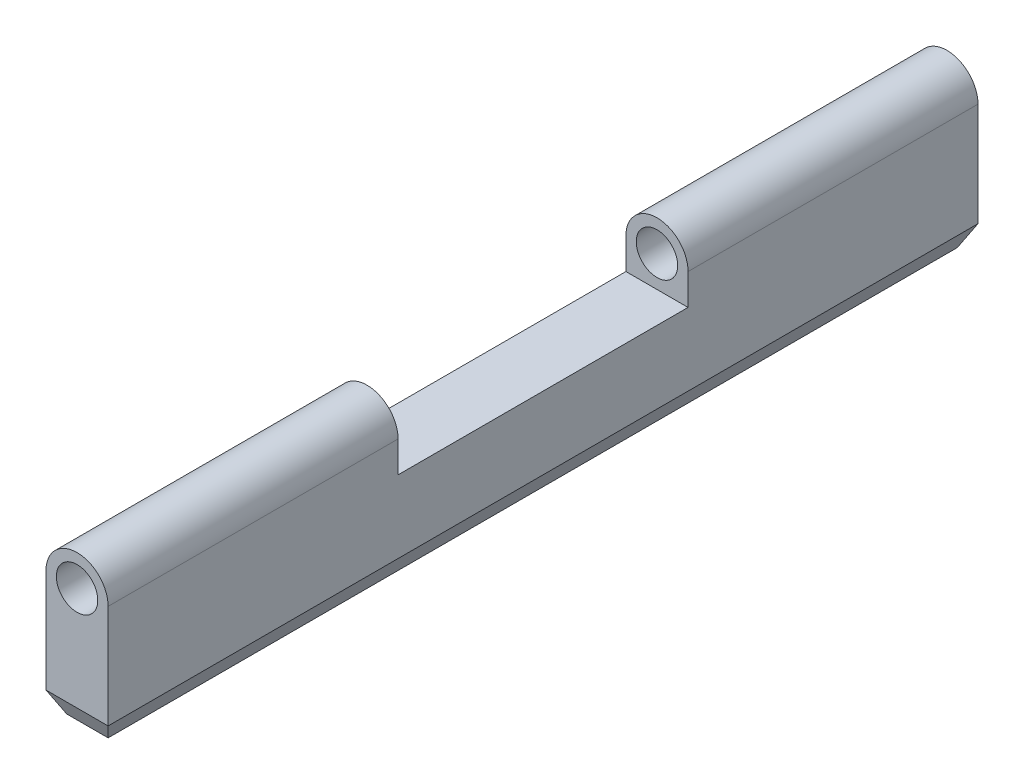
ISO-10303-21;
HEADER;
FILE_DESCRIPTION(('STEP AP214'),'2;1');
FILE_NAME('part.step','',(''),(''),'','','');
FILE_SCHEMA(('AUTOMOTIVE_DESIGN { 1 0 10303 214 1 1 1 1 }'));
ENDSEC;
DATA;
#1=APPLICATION_CONTEXT('core data for automotive mechanical design processes');
#2=APPLICATION_PROTOCOL_DEFINITION('international standard','automotive_design',2000,#1);
#3=PRODUCT_CONTEXT('',#1,'mechanical');
#4=PRODUCT('Part','Part','',(#3));
#5=PRODUCT_RELATED_PRODUCT_CATEGORY('part','',(#4));
#6=PRODUCT_DEFINITION_FORMATION('','',#4);
#7=PRODUCT_DEFINITION_CONTEXT('part definition',#1,'design');
#8=PRODUCT_DEFINITION('design','',#6,#7);
#9=PRODUCT_DEFINITION_SHAPE('','',#8);
#10=(LENGTH_UNIT() NAMED_UNIT(*) SI_UNIT(.MILLI.,.METRE.));
#11=(NAMED_UNIT(*) PLANE_ANGLE_UNIT() SI_UNIT($,.RADIAN.));
#12=(NAMED_UNIT(*) SI_UNIT($,.STERADIAN.) SOLID_ANGLE_UNIT());
#13=UNCERTAINTY_MEASURE_WITH_UNIT(LENGTH_MEASURE(1.E-05),#10,'distance_accuracy_value','');
#14=(GEOMETRIC_REPRESENTATION_CONTEXT(3) GLOBAL_UNCERTAINTY_ASSIGNED_CONTEXT((#13)) GLOBAL_UNIT_ASSIGNED_CONTEXT((#10,
#11,#12)) REPRESENTATION_CONTEXT('',''));
#15=CARTESIAN_POINT('',(0.,0.,0.));
#16=DIRECTION('',(0.,0.,1.));
#17=DIRECTION('',(1.,0.,0.));
#18=AXIS2_PLACEMENT_3D('',#15,#16,#17);
#19=CARTESIAN_POINT('',(0.,2.87122348122344,42.));
#20=DIRECTION('',(0.,0.,-1.));
#21=DIRECTION('',(-1.,0.,0.));
#22=AXIS2_PLACEMENT_3D('',#19,#20,#21);
#23=CYLINDRICAL_SURFACE('',#22,1.5);
#24=DIRECTION('',(0.,0.,-1.));
#25=VECTOR('',#24,1.);
#26=CARTESIAN_POINT('',(1.5,2.87122348122344,42.));
#27=LINE('',#26,#25);
#28=CARTESIAN_POINT('',(1.5,2.87122348122344,42.));
#29=VERTEX_POINT('',#28);
#30=CARTESIAN_POINT('',(1.5,2.87122348122344,28.));
#31=VERTEX_POINT('',#30);
#32=EDGE_CURVE('E175',#29,#31,#27,.T.);
#33=ORIENTED_EDGE('',*,*,#32,.T.);
#34=CARTESIAN_POINT('',(0.,2.87122348122344,28.));
#35=DIRECTION('',(0.,0.,1.));
#36=DIRECTION('',(0.,-1.,0.));
#37=AXIS2_PLACEMENT_3D('',#34,#35,#36);
#38=CIRCLE('',#37,1.5);
#39=CARTESIAN_POINT('',(-1.5,2.87122348122344,28.));
#40=VERTEX_POINT('',#39);
#41=EDGE_CURVE('E119',#31,#40,#38,.T.);
#42=ORIENTED_EDGE('',*,*,#41,.T.);
#43=DIRECTION('',(0.,0.,-1.));
#44=VECTOR('',#43,1.);
#45=CARTESIAN_POINT('',(-1.5,2.87122348122344,42.));
#46=LINE('',#45,#44);
#47=CARTESIAN_POINT('',(-1.5,2.87122348122344,42.));
#48=VERTEX_POINT('',#47);
#49=EDGE_CURVE('E178',#48,#40,#46,.T.);
#50=ORIENTED_EDGE('',*,*,#49,.F.);
#51=CARTESIAN_POINT('',(0.,2.87122348122344,42.));
#52=DIRECTION('',(0.,0.,1.));
#53=DIRECTION('',(-1.,0.,0.));
#54=AXIS2_PLACEMENT_3D('',#51,#52,#53);
#55=CIRCLE('',#54,1.5);
#56=EDGE_CURVE('E161',#29,#48,#55,.T.);
#57=ORIENTED_EDGE('',*,*,#56,.F.);
#58=EDGE_LOOP('',(#33,#42,#50,#57));
#59=FACE_BOUND('',#58,.T.);
#60=ADVANCED_FACE('F35',(#59),#23,.T.);
#61=CARTESIAN_POINT('',(0.,2.87122348122344,42.));
#62=DIRECTION('',(0.,0.,-1.));
#63=DIRECTION('',(-1.,0.,0.));
#64=AXIS2_PLACEMENT_3D('',#61,#62,#63);
#65=CYLINDRICAL_SURFACE('',#64,1.);
#66=CARTESIAN_POINT('',(0.,2.87122348122344,14.));
#67=DIRECTION('',(0.,0.,-1.));
#68=DIRECTION('',(-1.,0.,0.));
#69=AXIS2_PLACEMENT_3D('',#66,#67,#68);
#70=CIRCLE('',#69,1.);
#71=CARTESIAN_POINT('',(-1.,2.87122348122344,14.));
#72=VERTEX_POINT('',#71);
#73=EDGE_CURVE('E151',#72,#72,#70,.T.);
#74=CARTESIAN_POINT('',(0.,2.87122348122344,0.));
#75=DIRECTION('',(0.,0.,1.));
#76=DIRECTION('',(1.,0.,0.));
#77=AXIS2_PLACEMENT_3D('',#74,#75,#76);
#78=CIRCLE('',#77,1.);
#79=CARTESIAN_POINT('',(-1.,2.87122348122344,0.));
#80=VERTEX_POINT('',#79);
#81=EDGE_CURVE('E154',#80,#80,#78,.T.);
#82=CARTESIAN_POINT('',(-1.,2.87122348122344,14.));
#83=CARTESIAN_POINT('',(-1.,2.87122348122344,13.8541666666667));
#84=CARTESIAN_POINT('',(-1.,2.87122348122344,13.7083333333333));
#85=CARTESIAN_POINT('',(-1.,2.87122348122344,13.4166666666667));
#86=CARTESIAN_POINT('',(-1.,2.87122348122344,13.2708333333333));
#87=CARTESIAN_POINT('',(-1.,2.87122348122344,12.9791666666667));
#88=CARTESIAN_POINT('',(-1.,2.87122348122344,12.8333333333333));
#89=CARTESIAN_POINT('',(-1.,2.87122348122344,12.5416666666667));
#90=CARTESIAN_POINT('',(-1.,2.87122348122344,12.3958333333333));
#91=CARTESIAN_POINT('',(-1.,2.87122348122344,12.1041666666667));
#92=CARTESIAN_POINT('',(-1.,2.87122348122344,11.9583333333333));
#93=CARTESIAN_POINT('',(-1.,2.87122348122344,11.6666666666667));
#94=CARTESIAN_POINT('',(-1.,2.87122348122344,11.5208333333333));
#95=CARTESIAN_POINT('',(-1.,2.87122348122344,11.2291666666667));
#96=CARTESIAN_POINT('',(-1.,2.87122348122344,11.0833333333333));
#97=CARTESIAN_POINT('',(-1.,2.87122348122344,10.7916666666667));
#98=CARTESIAN_POINT('',(-1.,2.87122348122344,10.6458333333333));
#99=CARTESIAN_POINT('',(-1.,2.87122348122344,10.3541666666667));
#100=CARTESIAN_POINT('',(-1.,2.87122348122344,10.2083333333333));
#101=CARTESIAN_POINT('',(-1.,2.87122348122344,9.91666666666668));
#102=CARTESIAN_POINT('',(-1.,2.87122348122344,9.77083333333335));
#103=CARTESIAN_POINT('',(-1.,2.87122348122344,9.47916666666668));
#104=CARTESIAN_POINT('',(-1.,2.87122348122344,9.33333333333335));
#105=CARTESIAN_POINT('',(-1.,2.87122348122344,9.04166666666668));
#106=CARTESIAN_POINT('',(-1.,2.87122348122344,8.89583333333335));
#107=CARTESIAN_POINT('',(-1.,2.87122348122344,8.60416666666668));
#108=CARTESIAN_POINT('',(-1.,2.87122348122344,8.45833333333335));
#109=CARTESIAN_POINT('',(-1.,2.87122348122344,8.16666666666668));
#110=CARTESIAN_POINT('',(-1.,2.87122348122344,8.02083333333334));
#111=CARTESIAN_POINT('',(-1.,2.87122348122344,7.72916666666668));
#112=CARTESIAN_POINT('',(-1.,2.87122348122344,7.58333333333334));
#113=CARTESIAN_POINT('',(-1.,2.87122348122344,7.29166666666668));
#114=CARTESIAN_POINT('',(-1.,2.87122348122344,7.14583333333334));
#115=CARTESIAN_POINT('',(-1.,2.87122348122344,6.85416666666667));
#116=CARTESIAN_POINT('',(-1.,2.87122348122344,6.70833333333334));
#117=CARTESIAN_POINT('',(-1.,2.87122348122344,6.41666666666668));
#118=CARTESIAN_POINT('',(-1.,2.87122348122344,6.27083333333334));
#119=CARTESIAN_POINT('',(-1.,2.87122348122344,5.97916666666667));
#120=CARTESIAN_POINT('',(-1.,2.87122348122344,5.83333333333334));
#121=CARTESIAN_POINT('',(-1.,2.87122348122344,5.54166666666668));
#122=CARTESIAN_POINT('',(-1.,2.87122348122344,5.39583333333334));
#123=CARTESIAN_POINT('',(-1.,2.87122348122344,5.10416666666667));
#124=CARTESIAN_POINT('',(-1.,2.87122348122344,4.95833333333334));
#125=CARTESIAN_POINT('',(-1.,2.87122348122344,4.66666666666667));
#126=CARTESIAN_POINT('',(-1.,2.87122348122344,4.52083333333334));
#127=CARTESIAN_POINT('',(-1.,2.87122348122344,4.22916666666667));
#128=CARTESIAN_POINT('',(-1.,2.87122348122344,4.08333333333334));
#129=CARTESIAN_POINT('',(-1.,2.87122348122344,3.79166666666667));
#130=CARTESIAN_POINT('',(-1.,2.87122348122344,3.64583333333334));
#131=CARTESIAN_POINT('',(-1.,2.87122348122344,3.35416666666667));
#132=CARTESIAN_POINT('',(-1.,2.87122348122344,3.20833333333334));
#133=CARTESIAN_POINT('',(-1.,2.87122348122344,2.91666666666667));
#134=CARTESIAN_POINT('',(-1.,2.87122348122344,2.77083333333334));
#135=CARTESIAN_POINT('',(-1.,2.87122348122344,2.47916666666667));
#136=CARTESIAN_POINT('',(-1.,2.87122348122344,2.33333333333334));
#137=CARTESIAN_POINT('',(-1.,2.87122348122344,2.04166666666667));
#138=CARTESIAN_POINT('',(-1.,2.87122348122344,1.89583333333333));
#139=CARTESIAN_POINT('',(-1.,2.87122348122344,1.60416666666667));
#140=CARTESIAN_POINT('',(-1.,2.87122348122344,1.45833333333333));
#141=CARTESIAN_POINT('',(-1.,2.87122348122344,1.16666666666667));
#142=CARTESIAN_POINT('',(-1.,2.87122348122344,1.02083333333333));
#143=CARTESIAN_POINT('',(-1.,2.87122348122344,0.729166666666667));
#144=CARTESIAN_POINT('',(-1.,2.87122348122344,0.583333333333334));
#145=CARTESIAN_POINT('',(-1.,2.87122348122344,0.291666666666667));
#146=CARTESIAN_POINT('',(-1.,2.87122348122344,0.145833333333333));
#147=CARTESIAN_POINT('',(-1.,2.87122348122344,0.));
#148=B_SPLINE_CURVE_WITH_KNOTS('',3,(#82,#83,#84,#85,#86,#87,#88,#89,#90,#91,#92,#93,#94,#95,
#96,#97,#98,#99,#100,#101,#102,#103,#104,#105,#106,#107,#108,#109,#110,#111,#112,#113,#114,#115,
#116,#117,#118,#119,#120,#121,#122,#123,#124,#125,#126,#127,#128,#129,#130,#131,#132,#133,#134,
#135,#136,#137,#138,#139,#140,#141,#142,#143,#144,#145,#146,#147),.UNSPECIFIED.,.F.,.F.,(4,2,2,
2,2,2,2,2,2,2,2,2,2,2,2,2,2,2,2,2,2,2,2,2,2,2,2,2,2,2,2,2,4),(0.,0.4375,0.875000000000001,
1.3125,1.75,2.1875,2.625,3.0625,3.5,3.9375,4.375,4.8125,5.25,5.6875,6.12500000000001,6.5625,
7.00000000000001,7.4375,7.87500000000001,8.3125,8.75000000000001,9.18750000000001,
9.62500000000001,10.0625,10.5,10.9375,11.375,11.8125,12.25,12.6875,13.125,13.5625,14.),.UNSPECIFIED.);
#149=EDGE_CURVE('BSEAM247',#72,#80,#148,.T.);
#150=ORIENTED_EDGE('',*,*,#73,.F.);
#151=ORIENTED_EDGE('',*,*,#81,.F.);
#152=ORIENTED_EDGE('',*,*,#149,.T.);
#153=ORIENTED_EDGE('',*,*,#149,.F.);
#154=EDGE_LOOP('',(#150,#152,#151,#153));
#155=FACE_BOUND('',#154,.T.);
#156=ADVANCED_FACE('F247',(#155),#65,.F.);
#157=CARTESIAN_POINT('',(0.,2.87122348122344,42.));
#158=DIRECTION('',(0.,0.,-1.));
#159=DIRECTION('',(-1.,0.,0.));
#160=AXIS2_PLACEMENT_3D('',#157,#158,#159);
#161=PLANE('',#160);
#162=DIRECTION('',(0.,-1.,0.));
#163=VECTOR('',#162,1.);
#164=CARTESIAN_POINT('',(-1.5,2.87122348122344,42.));
#165=LINE('',#164,#163);
#166=CARTESIAN_POINT('',(-1.5,-2.12877651877655,42.));
#167=VERTEX_POINT('',#166);
#168=EDGE_CURVE('E164',#48,#167,#165,.T.);
#169=ORIENTED_EDGE('',*,*,#168,.T.);
#170=DIRECTION('',(1.,0.,0.));
#171=VECTOR('',#170,1.);
#172=CARTESIAN_POINT('',(0.,-2.12877651877655,42.));
#173=LINE('',#172,#171);
#174=CARTESIAN_POINT('',(1.5,-2.12877651877655,42.));
#175=VERTEX_POINT('',#174);
#176=EDGE_CURVE('E45',#167,#175,#173,.T.);
#177=ORIENTED_EDGE('',*,*,#176,.T.);
#178=DIRECTION('',(0.,1.,0.));
#179=VECTOR('',#178,1.);
#180=CARTESIAN_POINT('',(1.5,-3.12877651877656,42.));
#181=LINE('',#180,#179);
#182=EDGE_CURVE('E167',#175,#29,#181,.T.);
#183=ORIENTED_EDGE('',*,*,#182,.T.);
#184=ORIENTED_EDGE('',*,*,#56,.T.);
#185=EDGE_LOOP('',(#169,#177,#183,#184));
#186=FACE_BOUND('',#185,.T.);
#187=CARTESIAN_POINT('',(0.,2.87122348122344,42.));
#188=DIRECTION('',(0.,0.,1.));
#189=DIRECTION('',(1.,0.,0.));
#190=AXIS2_PLACEMENT_3D('',#187,#188,#189);
#191=CIRCLE('',#190,1.);
#192=CARTESIAN_POINT('',(-1.,2.87122348122344,42.));
#193=VERTEX_POINT('',#192);
#194=EDGE_CURVE('E155',#193,#193,#191,.T.);
#195=ORIENTED_EDGE('',*,*,#194,.F.);
#196=EDGE_LOOP('',(#195));
#197=FACE_BOUND('',#196,.T.);
#198=ADVANCED_FACE('F252',(#186,#197),#161,.F.);
#199=CARTESIAN_POINT('',(0.,2.87122348122344,0.));
#200=DIRECTION('',(0.,0.,-1.));
#201=DIRECTION('',(-1.,0.,0.));
#202=AXIS2_PLACEMENT_3D('',#199,#200,#201);
#203=PLANE('',#202);
#204=DIRECTION('',(0.,1.,0.));
#205=VECTOR('',#204,1.);
#206=CARTESIAN_POINT('',(1.5,-3.12877651877656,0.));
#207=LINE('',#206,#205);
#208=CARTESIAN_POINT('',(1.5,-2.12877651877655,0.));
#209=VERTEX_POINT('',#208);
#210=CARTESIAN_POINT('',(1.5,2.87122348122344,0.));
#211=VERTEX_POINT('',#210);
#212=EDGE_CURVE('E165',#209,#211,#207,.T.);
#213=ORIENTED_EDGE('',*,*,#212,.F.);
#214=DIRECTION('',(-1.,0.,0.));
#215=VECTOR('',#214,1.);
#216=CARTESIAN_POINT('',(-1.5,-2.12877651877655,0.));
#217=LINE('',#216,#215);
#218=CARTESIAN_POINT('',(-1.5,-2.12877651877655,0.));
#219=VERTEX_POINT('',#218);
#220=EDGE_CURVE('E194',#209,#219,#217,.T.);
#221=ORIENTED_EDGE('',*,*,#220,.T.);
#222=DIRECTION('',(0.,-1.,0.));
#223=VECTOR('',#222,1.);
#224=CARTESIAN_POINT('',(-1.5,2.87122348122344,0.));
#225=LINE('',#224,#223);
#226=CARTESIAN_POINT('',(-1.5,2.87122348122344,0.));
#227=VERTEX_POINT('',#226);
#228=EDGE_CURVE('E172',#227,#219,#225,.T.);
#229=ORIENTED_EDGE('',*,*,#228,.F.);
#230=CARTESIAN_POINT('',(0.,2.87122348122344,0.));
#231=DIRECTION('',(0.,0.,1.));
#232=DIRECTION('',(-1.,0.,0.));
#233=AXIS2_PLACEMENT_3D('',#230,#231,#232);
#234=CIRCLE('',#233,1.5);
#235=EDGE_CURVE('E158',#211,#227,#234,.T.);
#236=ORIENTED_EDGE('',*,*,#235,.F.);
#237=EDGE_LOOP('',(#213,#221,#229,#236));
#238=FACE_BOUND('',#237,.T.);
#239=ORIENTED_EDGE('',*,*,#81,.T.);
#240=EDGE_LOOP('',(#239));
#241=FACE_BOUND('',#240,.T.);
#242=ADVANCED_FACE('F223',(#238,#241),#203,.T.);
#243=CARTESIAN_POINT('',(-1.5,2.87122348122344,14.));
#244=VERTEX_POINT('',#243);
#245=EDGE_CURVE('E177',#244,#227,#46,.T.);
#246=ORIENTED_EDGE('',*,*,#245,.F.);
#247=CARTESIAN_POINT('',(0.,2.87122348122344,14.));
#248=DIRECTION('',(0.,0.,-1.));
#249=DIRECTION('',(-1.,0.,0.));
#250=AXIS2_PLACEMENT_3D('',#247,#248,#249);
#251=CIRCLE('',#250,1.5);
#252=CARTESIAN_POINT('',(1.5,2.87122348122344,14.));
#253=VERTEX_POINT('',#252);
#254=EDGE_CURVE('E152',#244,#253,#251,.T.);
#255=ORIENTED_EDGE('',*,*,#254,.T.);
#256=EDGE_CURVE('E169',#253,#211,#27,.T.);
#257=ORIENTED_EDGE('',*,*,#256,.T.);
#258=ORIENTED_EDGE('',*,*,#235,.T.);
#259=EDGE_LOOP('',(#246,#255,#257,#258));
#260=FACE_BOUND('',#259,.T.);
#261=ADVANCED_FACE('F220',(#260),#23,.T.);
#262=CARTESIAN_POINT('',(-1.5,2.87122348122344,42.));
#263=DIRECTION('',(1.,0.,0.));
#264=DIRECTION('',(0.,1.,0.));
#265=AXIS2_PLACEMENT_3D('',#262,#263,#264);
#266=PLANE('',#265);
#267=ORIENTED_EDGE('',*,*,#228,.T.);
#268=DIRECTION('',(0.,0.,1.));
#269=VECTOR('',#268,1.);
#270=CARTESIAN_POINT('',(-1.5,-2.12877651877655,42.));
#271=LINE('',#270,#269);
#272=EDGE_CURVE('E60',#219,#167,#271,.T.);
#273=ORIENTED_EDGE('',*,*,#272,.T.);
#274=ORIENTED_EDGE('',*,*,#168,.F.);
#275=ORIENTED_EDGE('',*,*,#49,.T.);
#276=DIRECTION('',(0.,-1.,0.));
#277=VECTOR('',#276,1.);
#278=CARTESIAN_POINT('',(-1.5,4.37122348122344,28.));
#279=LINE('',#278,#277);
#280=CARTESIAN_POINT('',(-1.5,1.37122348122344,28.));
#281=VERTEX_POINT('',#280);
#282=EDGE_CURVE('E142',#40,#281,#279,.T.);
#283=ORIENTED_EDGE('',*,*,#282,.T.);
#284=DIRECTION('',(0.,0.,-1.));
#285=VECTOR('',#284,1.);
#286=CARTESIAN_POINT('',(-1.5,1.37122348122344,14.));
#287=LINE('',#286,#285);
#288=CARTESIAN_POINT('',(-1.5,1.37122348122344,14.));
#289=VERTEX_POINT('',#288);
#290=EDGE_CURVE('E132',#281,#289,#287,.T.);
#291=ORIENTED_EDGE('',*,*,#290,.T.);
#292=DIRECTION('',(0.,1.,0.));
#293=VECTOR('',#292,1.);
#294=CARTESIAN_POINT('',(-1.5,4.37122348122344,14.));
#295=LINE('',#294,#293);
#296=EDGE_CURVE('E139',#289,#244,#295,.T.);
#297=ORIENTED_EDGE('',*,*,#296,.T.);
#298=ORIENTED_EDGE('',*,*,#245,.T.);
#299=EDGE_LOOP('',(#267,#273,#274,#275,#283,#291,#297,#298));
#300=FACE_BOUND('',#299,.T.);
#301=ADVANCED_FACE('F226',(#300),#266,.F.);
#302=CARTESIAN_POINT('',(-1.5,-3.12877651877656,42.));
#303=DIRECTION('',(0.,1.,0.));
#304=DIRECTION('',(0.,0.,1.));
#305=AXIS2_PLACEMENT_3D('',#302,#303,#304);
#306=PLANE('',#305);
#307=DIRECTION('',(0.,0.,-1.));
#308=VECTOR('',#307,1.);
#309=CARTESIAN_POINT('',(-1.,-3.12877651877656,42.));
#310=LINE('',#309,#308);
#311=CARTESIAN_POINT('',(-1.,-3.12877651877656,41.5));
#312=VERTEX_POINT('',#311);
#313=CARTESIAN_POINT('',(-1.,-3.12877651877656,0.5));
#314=VERTEX_POINT('',#313);
#315=EDGE_CURVE('E189',#312,#314,#310,.T.);
#316=ORIENTED_EDGE('',*,*,#315,.T.);
#317=DIRECTION('',(1.,0.,0.));
#318=VECTOR('',#317,1.);
#319=CARTESIAN_POINT('',(1.5,-3.12877651877656,0.5));
#320=LINE('',#319,#318);
#321=CARTESIAN_POINT('',(1.,-3.12877651877656,0.5));
#322=VERTEX_POINT('',#321);
#323=EDGE_CURVE('E191',#314,#322,#320,.T.);
#324=ORIENTED_EDGE('',*,*,#323,.T.);
#325=DIRECTION('',(0.,0.,1.));
#326=VECTOR('',#325,1.);
#327=CARTESIAN_POINT('',(1.,-3.12877651877656,42.));
#328=LINE('',#327,#326);
#329=CARTESIAN_POINT('',(1.,-3.12877651877656,41.5));
#330=VERTEX_POINT('',#329);
#331=EDGE_CURVE('E181',#322,#330,#328,.T.);
#332=ORIENTED_EDGE('',*,*,#331,.T.);
#333=DIRECTION('',(-1.,0.,0.));
#334=VECTOR('',#333,1.);
#335=CARTESIAN_POINT('',(-1.5,-3.12877651877656,41.5));
#336=LINE('',#335,#334);
#337=EDGE_CURVE('E187',#330,#312,#336,.T.);
#338=ORIENTED_EDGE('',*,*,#337,.T.);
#339=EDGE_LOOP('',(#316,#324,#332,#338));
#340=FACE_BOUND('',#339,.T.);
#341=ADVANCED_FACE('F263',(#340),#306,.F.);
#342=CARTESIAN_POINT('',(1.5,-3.12877651877656,42.));
#343=DIRECTION('',(-1.,0.,0.));
#344=DIRECTION('',(0.,-1.,0.));
#345=AXIS2_PLACEMENT_3D('',#342,#343,#344);
#346=PLANE('',#345);
#347=ORIENTED_EDGE('',*,*,#182,.F.);
#348=DIRECTION('',(0.,0.,-1.));
#349=VECTOR('',#348,1.);
#350=CARTESIAN_POINT('',(1.5,-2.12877651877655,42.));
#351=LINE('',#350,#349);
#352=EDGE_CURVE('E11',#175,#209,#351,.T.);
#353=ORIENTED_EDGE('',*,*,#352,.T.);
#354=ORIENTED_EDGE('',*,*,#212,.T.);
#355=ORIENTED_EDGE('',*,*,#256,.F.);
#356=DIRECTION('',(0.,1.,0.));
#357=VECTOR('',#356,1.);
#358=CARTESIAN_POINT('',(1.5,4.37122348122344,14.));
#359=LINE('',#358,#357);
#360=CARTESIAN_POINT('',(1.5,1.37122348122344,14.));
#361=VERTEX_POINT('',#360);
#362=EDGE_CURVE('E125',#361,#253,#359,.T.);
#363=ORIENTED_EDGE('',*,*,#362,.F.);
#364=DIRECTION('',(0.,0.,-1.));
#365=VECTOR('',#364,1.);
#366=CARTESIAN_POINT('',(1.5,1.37122348122344,14.));
#367=LINE('',#366,#365);
#368=CARTESIAN_POINT('',(1.5,1.37122348122344,28.));
#369=VERTEX_POINT('',#368);
#370=EDGE_CURVE('E124',#369,#361,#367,.T.);
#371=ORIENTED_EDGE('',*,*,#370,.F.);
#372=DIRECTION('',(0.,-1.,0.));
#373=VECTOR('',#372,1.);
#374=CARTESIAN_POINT('',(1.5,4.37122348122344,28.));
#375=LINE('',#374,#373);
#376=EDGE_CURVE('E113',#31,#369,#375,.T.);
#377=ORIENTED_EDGE('',*,*,#376,.F.);
#378=ORIENTED_EDGE('',*,*,#32,.F.);
#379=EDGE_LOOP('',(#347,#353,#354,#355,#363,#371,#377,#378));
#380=FACE_BOUND('',#379,.T.);
#381=ADVANCED_FACE('F136',(#380),#346,.F.);
#382=CARTESIAN_POINT('',(0.,2.87122348122344,28.));
#383=DIRECTION('',(0.,0.,1.));
#384=DIRECTION('',(0.,-1.,0.));
#385=AXIS2_PLACEMENT_3D('',#382,#383,#384);
#386=CIRCLE('',#385,1.);
#387=CARTESIAN_POINT('',(-1.,2.87122348122344,28.));
#388=VERTEX_POINT('',#387);
#389=EDGE_CURVE('E148',#388,#388,#386,.T.);
#390=CARTESIAN_POINT('',(-1.,2.87122348122344,28.));
#391=CARTESIAN_POINT('',(-1.,2.87122348122344,28.1458333333333));
#392=CARTESIAN_POINT('',(-1.,2.87122348122344,28.2916666666667));
#393=CARTESIAN_POINT('',(-1.,2.87122348122344,28.5833333333333));
#394=CARTESIAN_POINT('',(-1.,2.87122348122344,28.7291666666667));
#395=CARTESIAN_POINT('',(-1.,2.87122348122344,29.0208333333333));
#396=CARTESIAN_POINT('',(-1.,2.87122348122344,29.1666666666667));
#397=CARTESIAN_POINT('',(-1.,2.87122348122344,29.4583333333333));
#398=CARTESIAN_POINT('',(-1.,2.87122348122344,29.6041666666667));
#399=CARTESIAN_POINT('',(-1.,2.87122348122344,29.8958333333333));
#400=CARTESIAN_POINT('',(-1.,2.87122348122344,30.0416666666667));
#401=CARTESIAN_POINT('',(-1.,2.87122348122344,30.3333333333333));
#402=CARTESIAN_POINT('',(-1.,2.87122348122344,30.4791666666667));
#403=CARTESIAN_POINT('',(-1.,2.87122348122344,30.7708333333333));
#404=CARTESIAN_POINT('',(-1.,2.87122348122344,30.9166666666667));
#405=CARTESIAN_POINT('',(-1.,2.87122348122344,31.2083333333333));
#406=CARTESIAN_POINT('',(-1.,2.87122348122344,31.3541666666667));
#407=CARTESIAN_POINT('',(-1.,2.87122348122344,31.6458333333333));
#408=CARTESIAN_POINT('',(-1.,2.87122348122344,31.7916666666667));
#409=CARTESIAN_POINT('',(-1.,2.87122348122344,32.0833333333333));
#410=CARTESIAN_POINT('',(-1.,2.87122348122344,32.2291666666667));
#411=CARTESIAN_POINT('',(-1.,2.87122348122344,32.5208333333333));
#412=CARTESIAN_POINT('',(-1.,2.87122348122344,32.6666666666667));
#413=CARTESIAN_POINT('',(-1.,2.87122348122344,32.9583333333333));
#414=CARTESIAN_POINT('',(-1.,2.87122348122344,33.1041666666667));
#415=CARTESIAN_POINT('',(-1.,2.87122348122344,33.3958333333333));
#416=CARTESIAN_POINT('',(-1.,2.87122348122344,33.5416666666667));
#417=CARTESIAN_POINT('',(-1.,2.87122348122344,33.8333333333333));
#418=CARTESIAN_POINT('',(-1.,2.87122348122344,33.9791666666667));
#419=CARTESIAN_POINT('',(-1.,2.87122348122344,34.2708333333333));
#420=CARTESIAN_POINT('',(-1.,2.87122348122344,34.4166666666667));
#421=CARTESIAN_POINT('',(-1.,2.87122348122344,34.7083333333333));
#422=CARTESIAN_POINT('',(-1.,2.87122348122344,34.8541666666667));
#423=CARTESIAN_POINT('',(-1.,2.87122348122344,35.1458333333333));
#424=CARTESIAN_POINT('',(-1.,2.87122348122344,35.2916666666667));
#425=CARTESIAN_POINT('',(-1.,2.87122348122344,35.5833333333333));
#426=CARTESIAN_POINT('',(-1.,2.87122348122344,35.7291666666667));
#427=CARTESIAN_POINT('',(-1.,2.87122348122344,36.0208333333333));
#428=CARTESIAN_POINT('',(-1.,2.87122348122344,36.1666666666667));
#429=CARTESIAN_POINT('',(-1.,2.87122348122344,36.4583333333333));
#430=CARTESIAN_POINT('',(-1.,2.87122348122344,36.6041666666667));
#431=CARTESIAN_POINT('',(-1.,2.87122348122344,36.8958333333333));
#432=CARTESIAN_POINT('',(-1.,2.87122348122344,37.0416666666667));
#433=CARTESIAN_POINT('',(-1.,2.87122348122344,37.3333333333333));
#434=CARTESIAN_POINT('',(-1.,2.87122348122344,37.4791666666667));
#435=CARTESIAN_POINT('',(-1.,2.87122348122344,37.7708333333333));
#436=CARTESIAN_POINT('',(-1.,2.87122348122344,37.9166666666667));
#437=CARTESIAN_POINT('',(-1.,2.87122348122344,38.2083333333333));
#438=CARTESIAN_POINT('',(-1.,2.87122348122344,38.3541666666667));
#439=CARTESIAN_POINT('',(-1.,2.87122348122344,38.6458333333333));
#440=CARTESIAN_POINT('',(-1.,2.87122348122344,38.7916666666667));
#441=CARTESIAN_POINT('',(-1.,2.87122348122344,39.0833333333333));
#442=CARTESIAN_POINT('',(-1.,2.87122348122344,39.2291666666667));
#443=CARTESIAN_POINT('',(-1.,2.87122348122344,39.5208333333333));
#444=CARTESIAN_POINT('',(-1.,2.87122348122344,39.6666666666667));
#445=CARTESIAN_POINT('',(-1.,2.87122348122344,39.9583333333333));
#446=CARTESIAN_POINT('',(-1.,2.87122348122344,40.1041666666667));
#447=CARTESIAN_POINT('',(-1.,2.87122348122344,40.3958333333333));
#448=CARTESIAN_POINT('',(-1.,2.87122348122344,40.5416666666667));
#449=CARTESIAN_POINT('',(-1.,2.87122348122344,40.8333333333333));
#450=CARTESIAN_POINT('',(-1.,2.87122348122344,40.9791666666667));
#451=CARTESIAN_POINT('',(-1.,2.87122348122344,41.2708333333333));
#452=CARTESIAN_POINT('',(-1.,2.87122348122344,41.4166666666667));
#453=CARTESIAN_POINT('',(-1.,2.87122348122344,41.7083333333333));
#454=CARTESIAN_POINT('',(-1.,2.87122348122344,41.8541666666667));
#455=CARTESIAN_POINT('',(-1.,2.87122348122344,42.));
#456=B_SPLINE_CURVE_WITH_KNOTS('',3,(#390,#391,#392,#393,#394,#395,#396,#397,#398,#399,#400,
#401,#402,#403,#404,#405,#406,#407,#408,#409,#410,#411,#412,#413,#414,#415,#416,#417,#418,#419,
#420,#421,#422,#423,#424,#425,#426,#427,#428,#429,#430,#431,#432,#433,#434,#435,#436,#437,#438,
#439,#440,#441,#442,#443,#444,#445,#446,#447,#448,#449,#450,#451,#452,#453,#454,#455),
.UNSPECIFIED.,.F.,.F.,(4,2,2,2,2,2,2,2,2,2,2,2,2,2,2,2,2,2,2,2,2,2,2,2,2,2,2,2,2,2,2,2,4),(0.,
0.4375,0.874999999999997,1.3125,1.74999999999999,2.1875,2.625,3.0625,3.5,3.9375,4.375,4.8125,
5.25,5.6875,6.12499999999999,6.56249999999999,6.99999999999999,7.43749999999999,
7.87499999999999,8.31249999999999,8.74999999999999,9.18749999999999,9.62499999999999,10.0625,
10.5,10.9375,11.375,11.8125,12.25,12.6875,13.125,13.5625,14.),.UNSPECIFIED.);
#457=EDGE_CURVE('BSEAM255',#388,#193,#456,.T.);
#458=ORIENTED_EDGE('',*,*,#389,.F.);
#459=ORIENTED_EDGE('',*,*,#194,.T.);
#460=ORIENTED_EDGE('',*,*,#457,.T.);
#461=ORIENTED_EDGE('',*,*,#457,.F.);
#462=EDGE_LOOP('',(#458,#460,#459,#461));
#463=FACE_BOUND('',#462,.T.);
#464=ADVANCED_FACE('F255',(#463),#65,.F.);
#465=CARTESIAN_POINT('',(-1.5,4.37122348122344,14.));
#466=DIRECTION('',(0.,0.,-1.));
#467=DIRECTION('',(-1.,0.,0.));
#468=AXIS2_PLACEMENT_3D('',#465,#466,#467);
#469=PLANE('',#468);
#470=ORIENTED_EDGE('',*,*,#73,.T.);
#471=EDGE_LOOP('',(#470));
#472=FACE_BOUND('',#471,.T.);
#473=ORIENTED_EDGE('',*,*,#296,.F.);
#474=DIRECTION('',(1.,0.,0.));
#475=VECTOR('',#474,1.);
#476=CARTESIAN_POINT('',(-1.5,1.37122348122344,14.));
#477=LINE('',#476,#475);
#478=EDGE_CURVE('E134',#289,#361,#477,.T.);
#479=ORIENTED_EDGE('',*,*,#478,.T.);
#480=ORIENTED_EDGE('',*,*,#362,.T.);
#481=ORIENTED_EDGE('',*,*,#254,.F.);
#482=EDGE_LOOP('',(#473,#479,#480,#481));
#483=FACE_BOUND('',#482,.T.);
#484=ADVANCED_FACE('F214',(#472,#483),#469,.F.);
#485=CARTESIAN_POINT('',(-1.5,4.37122348122344,28.));
#486=DIRECTION('',(0.,0.,1.));
#487=DIRECTION('',(0.,-1.,0.));
#488=AXIS2_PLACEMENT_3D('',#485,#486,#487);
#489=PLANE('',#488);
#490=ORIENTED_EDGE('',*,*,#389,.T.);
#491=EDGE_LOOP('',(#490));
#492=FACE_BOUND('',#491,.T.);
#493=ORIENTED_EDGE('',*,*,#376,.T.);
#494=DIRECTION('',(1.,0.,0.));
#495=VECTOR('',#494,1.);
#496=CARTESIAN_POINT('',(-1.5,1.37122348122344,28.));
#497=LINE('',#496,#495);
#498=EDGE_CURVE('E117',#281,#369,#497,.T.);
#499=ORIENTED_EDGE('',*,*,#498,.F.);
#500=ORIENTED_EDGE('',*,*,#282,.F.);
#501=ORIENTED_EDGE('',*,*,#41,.F.);
#502=EDGE_LOOP('',(#493,#499,#500,#501));
#503=FACE_BOUND('',#502,.T.);
#504=ADVANCED_FACE('F115',(#492,#503),#489,.F.);
#505=CARTESIAN_POINT('',(-1.5,1.37122348122344,14.));
#506=DIRECTION('',(0.,-1.,0.));
#507=DIRECTION('',(0.,0.,-1.));
#508=AXIS2_PLACEMENT_3D('',#505,#506,#507);
#509=PLANE('',#508);
#510=ORIENTED_EDGE('',*,*,#478,.F.);
#511=ORIENTED_EDGE('',*,*,#290,.F.);
#512=ORIENTED_EDGE('',*,*,#498,.T.);
#513=ORIENTED_EDGE('',*,*,#370,.T.);
#514=EDGE_LOOP('',(#510,#511,#512,#513));
#515=FACE_BOUND('',#514,.T.);
#516=ADVANCED_FACE('F129',(#515),#509,.F.);
#517=CARTESIAN_POINT('',(0.,-2.12877651877655,42.));
#518=DIRECTION('',(0.,0.447213595499953,-0.894427190999918));
#519=DIRECTION('',(1.,0.,0.));
#520=AXIS2_PLACEMENT_3D('',#517,#518,#519);
#521=PLANE('',#520);
#522=DIRECTION('',(-0.40824829046386,-0.81649658092773,-0.408248290463859));
#523=VECTOR('',#522,1.);
#524=CARTESIAN_POINT('',(1.5,-2.12877651877655,42.));
#525=LINE('',#524,#523);
#526=EDGE_CURVE('E202',#175,#330,#525,.T.);
#527=ORIENTED_EDGE('',*,*,#526,.F.);
#528=ORIENTED_EDGE('',*,*,#176,.F.);
#529=DIRECTION('',(0.408248290463859,-0.81649658092773,-0.408248290463859));
#530=VECTOR('',#529,1.);
#531=CARTESIAN_POINT('',(-1.25000000000001,-2.62877651877655,41.75));
#532=LINE('',#531,#530);
#533=EDGE_CURVE('E40',#312,#167,#532,.F.);
#534=ORIENTED_EDGE('',*,*,#533,.F.);
#535=ORIENTED_EDGE('',*,*,#337,.F.);
#536=EDGE_LOOP('',(#527,#528,#534,#535));
#537=FACE_BOUND('',#536,.T.);
#538=ADVANCED_FACE('F38',(#537),#521,.F.);
#539=CARTESIAN_POINT('',(-1.,-3.12877651877656,42.));
#540=DIRECTION('',(0.894427190999919,0.447213595499952,0.));
#541=DIRECTION('',(0.,0.,-1.));
#542=AXIS2_PLACEMENT_3D('',#539,#540,#541);
#543=PLANE('',#542);
#544=ORIENTED_EDGE('',*,*,#533,.T.);
#545=ORIENTED_EDGE('',*,*,#272,.F.);
#546=DIRECTION('',(-0.408248290463859,0.81649658092773,-0.408248290463859));
#547=VECTOR('',#546,1.);
#548=CARTESIAN_POINT('',(5.91666666666653,-16.9621098521098,7.41666666666654));
#549=LINE('',#548,#547);
#550=EDGE_CURVE('E201',#314,#219,#549,.T.);
#551=ORIENTED_EDGE('',*,*,#550,.F.);
#552=ORIENTED_EDGE('',*,*,#315,.F.);
#553=EDGE_LOOP('',(#544,#545,#551,#552));
#554=FACE_BOUND('',#553,.T.);
#555=ADVANCED_FACE('F238',(#554),#543,.F.);
#556=CARTESIAN_POINT('',(1.5,-2.12877651877655,42.));
#557=DIRECTION('',(-0.894427190999918,0.447213595499953,0.));
#558=DIRECTION('',(0.,0.,-1.));
#559=AXIS2_PLACEMENT_3D('',#556,#557,#558);
#560=PLANE('',#559);
#561=ORIENTED_EDGE('',*,*,#526,.T.);
#562=ORIENTED_EDGE('',*,*,#331,.F.);
#563=DIRECTION('',(-0.40824829046386,-0.81649658092773,0.408248290463859));
#564=VECTOR('',#563,1.);
#565=CARTESIAN_POINT('',(-5.49999999999988,-16.1287765187765,6.99999999999987));
#566=LINE('',#565,#564);
#567=EDGE_CURVE('E199',#209,#322,#566,.T.);
#568=ORIENTED_EDGE('',*,*,#567,.F.);
#569=ORIENTED_EDGE('',*,*,#352,.F.);
#570=EDGE_LOOP('',(#561,#562,#568,#569));
#571=FACE_BOUND('',#570,.T.);
#572=ADVANCED_FACE('F233',(#571),#560,.F.);
#573=CARTESIAN_POINT('',(-1.5,-3.12877651877656,0.5));
#574=DIRECTION('',(0.,-0.447213595499953,-0.894427190999918));
#575=DIRECTION('',(-1.,0.,0.));
#576=AXIS2_PLACEMENT_3D('',#573,#574,#575);
#577=PLANE('',#576);
#578=ORIENTED_EDGE('',*,*,#550,.T.);
#579=ORIENTED_EDGE('',*,*,#220,.F.);
#580=ORIENTED_EDGE('',*,*,#567,.T.);
#581=ORIENTED_EDGE('',*,*,#323,.F.);
#582=EDGE_LOOP('',(#578,#579,#580,#581));
#583=FACE_BOUND('',#582,.T.);
#584=ADVANCED_FACE('F236',(#583),#577,.T.);
#585=CLOSED_SHELL('',(#60,#156,#198,#242,#261,#301,#341,#381,#464,#484,#504,#516,#538,#555,#572,#584));
#586=MANIFOLD_SOLID_BREP('B2',#585);
#587=ADVANCED_BREP_SHAPE_REPRESENTATION('',(#18,#586),#14);
#588=SHAPE_DEFINITION_REPRESENTATION(#9,#587);
ENDSEC;
END-ISO-10303-21;
